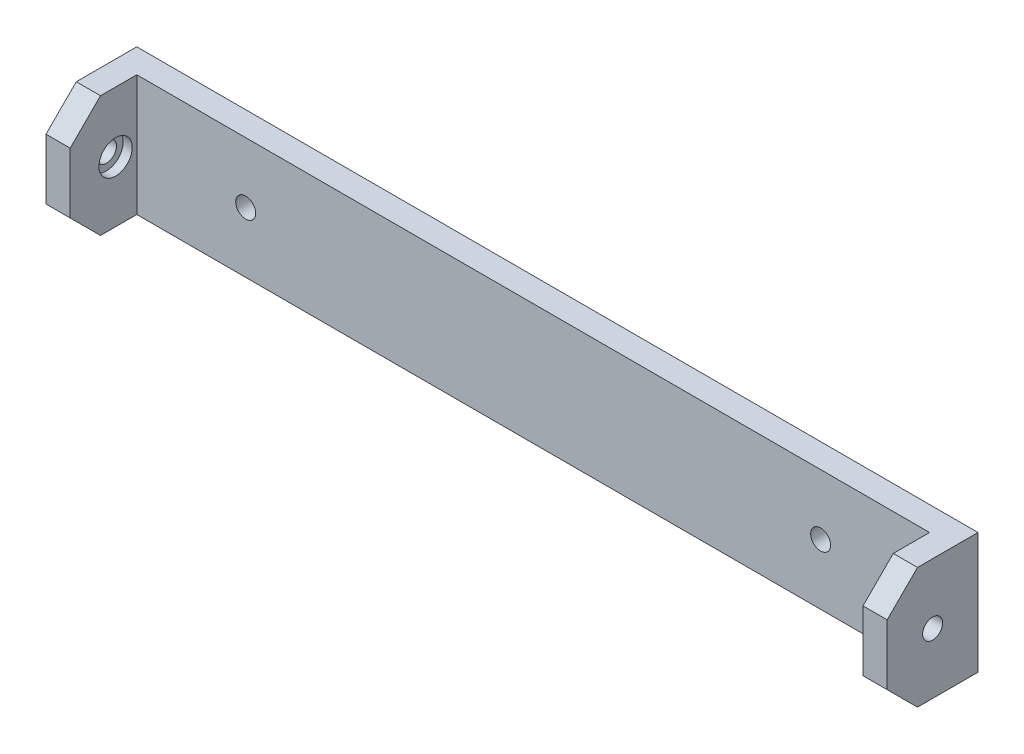
ISO-10303-21;
HEADER;
FILE_DESCRIPTION(('STEP AP214'),'2;1');
FILE_NAME('part.step','',(''),(''),'','','');
FILE_SCHEMA(('AUTOMOTIVE_DESIGN { 1 0 10303 214 1 1 1 1 }'));
ENDSEC;
DATA;
#1=APPLICATION_CONTEXT('core data for automotive mechanical design processes');
#2=APPLICATION_PROTOCOL_DEFINITION('international standard','automotive_design',2000,#1);
#3=PRODUCT_CONTEXT('',#1,'mechanical');
#4=PRODUCT('Part','Part','',(#3));
#5=PRODUCT_RELATED_PRODUCT_CATEGORY('part','',(#4));
#6=PRODUCT_DEFINITION_FORMATION('','',#4);
#7=PRODUCT_DEFINITION_CONTEXT('part definition',#1,'design');
#8=PRODUCT_DEFINITION('design','',#6,#7);
#9=PRODUCT_DEFINITION_SHAPE('','',#8);
#10=(LENGTH_UNIT() NAMED_UNIT(*) SI_UNIT(.MILLI.,.METRE.));
#11=(NAMED_UNIT(*) PLANE_ANGLE_UNIT() SI_UNIT($,.RADIAN.));
#12=(NAMED_UNIT(*) SI_UNIT($,.STERADIAN.) SOLID_ANGLE_UNIT());
#13=UNCERTAINTY_MEASURE_WITH_UNIT(LENGTH_MEASURE(1.E-05),#10,'distance_accuracy_value','');
#14=(GEOMETRIC_REPRESENTATION_CONTEXT(3) GLOBAL_UNCERTAINTY_ASSIGNED_CONTEXT((#13)) GLOBAL_UNIT_ASSIGNED_CONTEXT((#10,
#11,#12)) REPRESENTATION_CONTEXT('',''));
#15=CARTESIAN_POINT('',(0.,0.,0.));
#16=DIRECTION('',(0.,0.,1.));
#17=DIRECTION('',(1.,0.,0.));
#18=AXIS2_PLACEMENT_3D('',#15,#16,#17);
#19=CARTESIAN_POINT('',(65.5,0.,11.));
#20=DIRECTION('',(1.,0.,0.));
#21=DIRECTION('',(0.,1.,0.));
#22=AXIS2_PLACEMENT_3D('',#19,#20,#21);
#23=PLANE('',#22);
#24=DIRECTION('',(0.,-1.,0.));
#25=VECTOR('',#24,1.);
#26=CARTESIAN_POINT('',(65.5,0.,11.));
#27=LINE('',#26,#25);
#28=CARTESIAN_POINT('',(65.5,5.,11.));
#29=VERTEX_POINT('',#28);
#30=CARTESIAN_POINT('',(65.5,-5.,11.));
#31=VERTEX_POINT('',#30);
#32=EDGE_CURVE('E147',#29,#31,#27,.T.);
#33=ORIENTED_EDGE('',*,*,#32,.F.);
#34=DIRECTION('',(0.,0.707106781186548,-0.707106781186548));
#35=VECTOR('',#34,1.);
#36=CARTESIAN_POINT('',(65.5,5.,11.));
#37=LINE('',#36,#35);
#38=CARTESIAN_POINT('',(65.5,10.,6.));
#39=VERTEX_POINT('',#38);
#40=EDGE_CURVE('E49',#29,#39,#37,.T.);
#41=ORIENTED_EDGE('',*,*,#40,.T.);
#42=DIRECTION('',(0.,0.,-1.));
#43=VECTOR('',#42,1.);
#44=CARTESIAN_POINT('',(65.5,10.,11.));
#45=LINE('',#44,#43);
#46=CARTESIAN_POINT('',(65.5,10.,0.));
#47=VERTEX_POINT('',#46);
#48=EDGE_CURVE('E146',#39,#47,#45,.T.);
#49=ORIENTED_EDGE('',*,*,#48,.T.);
#50=DIRECTION('',(0.,-1.,0.));
#51=VECTOR('',#50,1.);
#52=CARTESIAN_POINT('',(65.5,0.,0.));
#53=LINE('',#52,#51);
#54=CARTESIAN_POINT('',(65.5,-10.,0.));
#55=VERTEX_POINT('',#54);
#56=EDGE_CURVE('E155',#47,#55,#53,.T.);
#57=ORIENTED_EDGE('',*,*,#56,.T.);
#58=DIRECTION('',(0.,0.,-1.));
#59=VECTOR('',#58,1.);
#60=CARTESIAN_POINT('',(65.5,-10.,11.));
#61=LINE('',#60,#59);
#62=CARTESIAN_POINT('',(65.5,-10.,6.));
#63=VERTEX_POINT('',#62);
#64=EDGE_CURVE('E136',#63,#55,#61,.T.);
#65=ORIENTED_EDGE('',*,*,#64,.F.);
#66=DIRECTION('',(0.,-0.707106781186548,-0.707106781186548));
#67=VECTOR('',#66,1.);
#68=CARTESIAN_POINT('',(65.5,-10.,6.));
#69=LINE('',#68,#67);
#70=EDGE_CURVE('E37',#63,#31,#69,.F.);
#71=ORIENTED_EDGE('',*,*,#70,.T.);
#72=EDGE_LOOP('',(#33,#41,#49,#57,#65,#71));
#73=FACE_BOUND('',#72,.T.);
#74=CARTESIAN_POINT('',(65.5,1.22485030690938E-10,3.5));
#75=DIRECTION('',(-1.,0.,0.));
#76=DIRECTION('',(0.,-1.,0.));
#77=AXIS2_PLACEMENT_3D('',#74,#75,#76);
#78=CIRCLE('',#77,2.75);
#79=CARTESIAN_POINT('',(65.5,-2.74999999987751,3.5));
#80=VERTEX_POINT('',#79);
#81=EDGE_CURVE('E444',#80,#80,#78,.T.);
#82=ORIENTED_EDGE('',*,*,#81,.F.);
#83=EDGE_LOOP('',(#82));
#84=FACE_BOUND('',#83,.T.);
#85=ADVANCED_FACE('F16',(#73,#84),#23,.F.);
#86=CARTESIAN_POINT('',(-500000.,-3.06158727938173E-11,3.5));
#87=DIRECTION('',(1.,0.,0.));
#88=DIRECTION('',(0.,1.,0.));
#89=AXIS2_PLACEMENT_3D('',#86,#87,#88);
#90=CYLINDRICAL_SURFACE('',#89,1.65);
#91=CARTESIAN_POINT('',(69.500000000005,0.,3.5));
#92=DIRECTION('',(-1.,0.,0.));
#93=DIRECTION('',(0.,-1.,0.));
#94=AXIS2_PLACEMENT_3D('',#91,#92,#93);
#95=CIRCLE('',#94,1.65);
#96=CARTESIAN_POINT('',(69.500000000005,-1.65,3.5));
#97=VERTEX_POINT('',#96);
#98=EDGE_CURVE('E167',#97,#97,#95,.T.);
#99=ORIENTED_EDGE('',*,*,#98,.F.);
#100=EDGE_LOOP('',(#99));
#101=FACE_BOUND('',#100,.T.);
#102=CARTESIAN_POINT('',(66.9999999999859,0.,3.5));
#103=DIRECTION('',(1.,0.,0.));
#104=DIRECTION('',(0.,1.,0.));
#105=AXIS2_PLACEMENT_3D('',#102,#103,#104);
#106=CIRCLE('',#105,1.65);
#107=CARTESIAN_POINT('',(66.9999999999859,1.65,3.5));
#108=VERTEX_POINT('',#107);
#109=EDGE_CURVE('E448',#108,#108,#106,.T.);
#110=ORIENTED_EDGE('',*,*,#109,.F.);
#111=EDGE_LOOP('',(#110));
#112=FACE_BOUND('',#111,.T.);
#113=ADVANCED_FACE('F388',(#101,#112),#90,.F.);
#114=CARTESIAN_POINT('',(0.,0.,0.));
#115=DIRECTION('',(0.,0.,1.));
#116=DIRECTION('',(1.,0.,0.));
#117=AXIS2_PLACEMENT_3D('',#114,#115,#116);
#118=PLANE('',#117);
#119=ORIENTED_EDGE('',*,*,#56,.F.);
#120=DIRECTION('',(1.,0.,0.));
#121=VECTOR('',#120,1.);
#122=CARTESIAN_POINT('',(-66.8605552431216,10.,0.));
#123=LINE('',#122,#121);
#124=CARTESIAN_POINT('',(-65.5,10.,0.));
#125=VERTEX_POINT('',#124);
#126=EDGE_CURVE('E161',#125,#47,#123,.T.);
#127=ORIENTED_EDGE('',*,*,#126,.F.);
#128=DIRECTION('',(0.,-1.,0.));
#129=VECTOR('',#128,1.);
#130=CARTESIAN_POINT('',(-65.5,0.,0.));
#131=LINE('',#130,#129);
#132=CARTESIAN_POINT('',(-65.5,-10.,0.));
#133=VERTEX_POINT('',#132);
#134=EDGE_CURVE('E158',#125,#133,#131,.T.);
#135=ORIENTED_EDGE('',*,*,#134,.T.);
#136=DIRECTION('',(1.,0.,0.));
#137=VECTOR('',#136,1.);
#138=CARTESIAN_POINT('',(-66.8605552431216,-10.,0.));
#139=LINE('',#138,#137);
#140=EDGE_CURVE('E140',#133,#55,#139,.T.);
#141=ORIENTED_EDGE('',*,*,#140,.T.);
#142=EDGE_LOOP('',(#119,#127,#135,#141));
#143=FACE_BOUND('',#142,.T.);
#144=CARTESIAN_POINT('',(-47.5,0.,0.));
#145=DIRECTION('',(0.,0.,1.));
#146=DIRECTION('',(1.,0.,0.));
#147=AXIS2_PLACEMENT_3D('',#144,#145,#146);
#148=CIRCLE('',#147,1.65);
#149=CARTESIAN_POINT('',(-45.85,0.,0.));
#150=VERTEX_POINT('',#149);
#151=EDGE_CURVE('E160',#150,#150,#148,.T.);
#152=ORIENTED_EDGE('',*,*,#151,.F.);
#153=EDGE_LOOP('',(#152));
#154=FACE_BOUND('',#153,.T.);
#155=CARTESIAN_POINT('',(47.5,0.,0.));
#156=DIRECTION('',(0.,0.,1.));
#157=DIRECTION('',(1.,0.,0.));
#158=AXIS2_PLACEMENT_3D('',#155,#156,#157);
#159=CIRCLE('',#158,1.65);
#160=CARTESIAN_POINT('',(49.15,0.,0.));
#161=VERTEX_POINT('',#160);
#162=EDGE_CURVE('E203',#161,#161,#159,.T.);
#163=ORIENTED_EDGE('',*,*,#162,.F.);
#164=EDGE_LOOP('',(#163));
#165=FACE_BOUND('',#164,.T.);
#166=ADVANCED_FACE('F152',(#143,#154,#165),#118,.T.);
#167=CARTESIAN_POINT('',(-66.8605552431216,10.,-4.));
#168=DIRECTION('',(0.,-1.,0.));
#169=DIRECTION('',(0.,0.,-1.));
#170=AXIS2_PLACEMENT_3D('',#167,#168,#169);
#171=PLANE('',#170);
#172=DIRECTION('',(0.,0.,1.));
#173=VECTOR('',#172,1.);
#174=CARTESIAN_POINT('',(-69.5,10.,-4.));
#175=LINE('',#174,#173);
#176=CARTESIAN_POINT('',(-69.5,10.,-4.));
#177=VERTEX_POINT('',#176);
#178=CARTESIAN_POINT('',(-69.5,10.,6.));
#179=VERTEX_POINT('',#178);
#180=EDGE_CURVE('E241',#177,#179,#175,.T.);
#181=ORIENTED_EDGE('',*,*,#180,.T.);
#182=DIRECTION('',(1.,0.,0.));
#183=VECTOR('',#182,1.);
#184=CARTESIAN_POINT('',(-65.5,10.,6.));
#185=LINE('',#184,#183);
#186=CARTESIAN_POINT('',(-65.5,10.,6.));
#187=VERTEX_POINT('',#186);
#188=EDGE_CURVE('E272',#179,#187,#185,.T.);
#189=ORIENTED_EDGE('',*,*,#188,.T.);
#190=DIRECTION('',(0.,0.,-1.));
#191=VECTOR('',#190,1.);
#192=CARTESIAN_POINT('',(-65.5,10.,11.));
#193=LINE('',#192,#191);
#194=EDGE_CURVE('E191',#187,#125,#193,.T.);
#195=ORIENTED_EDGE('',*,*,#194,.T.);
#196=ORIENTED_EDGE('',*,*,#126,.T.);
#197=ORIENTED_EDGE('',*,*,#48,.F.);
#198=DIRECTION('',(1.,0.,0.));
#199=VECTOR('',#198,1.);
#200=CARTESIAN_POINT('',(69.5,10.,6.));
#201=LINE('',#200,#199);
#202=CARTESIAN_POINT('',(69.5,10.,6.));
#203=VERTEX_POINT('',#202);
#204=EDGE_CURVE('E269',#39,#203,#201,.T.);
#205=ORIENTED_EDGE('',*,*,#204,.T.);
#206=DIRECTION('',(0.,0.,1.));
#207=VECTOR('',#206,1.);
#208=CARTESIAN_POINT('',(69.5,10.,-4.));
#209=LINE('',#208,#207);
#210=CARTESIAN_POINT('',(69.5,10.,-4.));
#211=VERTEX_POINT('',#210);
#212=EDGE_CURVE('E223',#211,#203,#209,.T.);
#213=ORIENTED_EDGE('',*,*,#212,.F.);
#214=DIRECTION('',(1.,0.,0.));
#215=VECTOR('',#214,1.);
#216=CARTESIAN_POINT('',(-66.8605552431216,10.,-4.));
#217=LINE('',#216,#215);
#218=EDGE_CURVE('E198',#177,#211,#217,.T.);
#219=ORIENTED_EDGE('',*,*,#218,.F.);
#220=EDGE_LOOP('',(#181,#189,#195,#196,#197,#205,#213,#219));
#221=FACE_BOUND('',#220,.T.);
#222=ADVANCED_FACE('F349',(#221),#171,.F.);
#223=CARTESIAN_POINT('',(-69.5,0.,-4.));
#224=DIRECTION('',(-1.,0.,0.));
#225=DIRECTION('',(0.,-1.,0.));
#226=AXIS2_PLACEMENT_3D('',#223,#224,#225);
#227=PLANE('',#226);
#228=CARTESIAN_POINT('',(-69.500000000005,0.,3.5));
#229=DIRECTION('',(-1.,0.,0.));
#230=DIRECTION('',(0.,-1.,0.));
#231=AXIS2_PLACEMENT_3D('',#228,#229,#230);
#232=CIRCLE('',#231,1.65);
#233=CARTESIAN_POINT('',(-69.500000000005,-1.65,3.5));
#234=VERTEX_POINT('',#233);
#235=EDGE_CURVE('E177',#234,#234,#232,.F.);
#236=ORIENTED_EDGE('',*,*,#235,.T.);
#237=EDGE_LOOP('',(#236));
#238=FACE_BOUND('',#237,.T.);
#239=DIRECTION('',(0.,0.,1.));
#240=VECTOR('',#239,1.);
#241=CARTESIAN_POINT('',(-69.5,-10.,-4.));
#242=LINE('',#241,#240);
#243=CARTESIAN_POINT('',(-69.5,-10.,-4.));
#244=VERTEX_POINT('',#243);
#245=CARTESIAN_POINT('',(-69.5,-10.,6.));
#246=VERTEX_POINT('',#245);
#247=EDGE_CURVE('E234',#244,#246,#242,.T.);
#248=ORIENTED_EDGE('',*,*,#247,.T.);
#249=DIRECTION('',(0.,-0.707106781186548,-0.707106781186548));
#250=VECTOR('',#249,1.);
#251=CARTESIAN_POINT('',(-69.5,-10.,6.));
#252=LINE('',#251,#250);
#253=CARTESIAN_POINT('',(-69.5,-5.,11.));
#254=VERTEX_POINT('',#253);
#255=EDGE_CURVE('E266',#246,#254,#252,.F.);
#256=ORIENTED_EDGE('',*,*,#255,.T.);
#257=DIRECTION('',(0.,-1.,0.));
#258=VECTOR('',#257,1.);
#259=CARTESIAN_POINT('',(-69.5,0.,11.));
#260=LINE('',#259,#258);
#261=CARTESIAN_POINT('',(-69.5,5.,11.));
#262=VERTEX_POINT('',#261);
#263=EDGE_CURVE('E187',#262,#254,#260,.T.);
#264=ORIENTED_EDGE('',*,*,#263,.F.);
#265=DIRECTION('',(0.,0.707106781186548,-0.707106781186548));
#266=VECTOR('',#265,1.);
#267=CARTESIAN_POINT('',(-69.5,10.,6.));
#268=LINE('',#267,#266);
#269=EDGE_CURVE('E263',#262,#179,#268,.T.);
#270=ORIENTED_EDGE('',*,*,#269,.T.);
#271=ORIENTED_EDGE('',*,*,#180,.F.);
#272=DIRECTION('',(0.,-1.,0.));
#273=VECTOR('',#272,1.);
#274=CARTESIAN_POINT('',(-69.5,0.,-4.));
#275=LINE('',#274,#273);
#276=EDGE_CURVE('E202',#177,#244,#275,.T.);
#277=ORIENTED_EDGE('',*,*,#276,.T.);
#278=EDGE_LOOP('',(#248,#256,#264,#270,#271,#277));
#279=FACE_BOUND('',#278,.T.);
#280=ADVANCED_FACE('F353',(#238,#279),#227,.T.);
#281=CARTESIAN_POINT('',(-66.8605552431216,-10.,-4.));
#282=DIRECTION('',(0.,-1.,0.));
#283=DIRECTION('',(0.,0.,-1.));
#284=AXIS2_PLACEMENT_3D('',#281,#282,#283);
#285=PLANE('',#284);
#286=DIRECTION('',(0.,0.,-1.));
#287=VECTOR('',#286,1.);
#288=CARTESIAN_POINT('',(-65.5,-10.,11.));
#289=LINE('',#288,#287);
#290=CARTESIAN_POINT('',(-65.5,-10.,6.));
#291=VERTEX_POINT('',#290);
#292=EDGE_CURVE('E193',#291,#133,#289,.T.);
#293=ORIENTED_EDGE('',*,*,#292,.F.);
#294=DIRECTION('',(-1.,0.,0.));
#295=VECTOR('',#294,1.);
#296=CARTESIAN_POINT('',(-66.8605552431216,-10.,6.));
#297=LINE('',#296,#295);
#298=EDGE_CURVE('E260',#291,#246,#297,.T.);
#299=ORIENTED_EDGE('',*,*,#298,.T.);
#300=ORIENTED_EDGE('',*,*,#247,.F.);
#301=DIRECTION('',(1.,0.,0.));
#302=VECTOR('',#301,1.);
#303=CARTESIAN_POINT('',(-66.8605552431216,-10.,-4.));
#304=LINE('',#303,#302);
#305=CARTESIAN_POINT('',(69.5,-10.,-4.));
#306=VERTEX_POINT('',#305);
#307=EDGE_CURVE('E207',#244,#306,#304,.T.);
#308=ORIENTED_EDGE('',*,*,#307,.T.);
#309=DIRECTION('',(0.,0.,1.));
#310=VECTOR('',#309,1.);
#311=CARTESIAN_POINT('',(69.5,-10.,-4.));
#312=LINE('',#311,#310);
#313=CARTESIAN_POINT('',(69.5,-10.,6.));
#314=VERTEX_POINT('',#313);
#315=EDGE_CURVE('E231',#306,#314,#312,.T.);
#316=ORIENTED_EDGE('',*,*,#315,.T.);
#317=DIRECTION('',(-1.,0.,0.));
#318=VECTOR('',#317,1.);
#319=CARTESIAN_POINT('',(-66.8605552431216,-10.,6.));
#320=LINE('',#319,#318);
#321=EDGE_CURVE('E143',#314,#63,#320,.T.);
#322=ORIENTED_EDGE('',*,*,#321,.T.);
#323=ORIENTED_EDGE('',*,*,#64,.T.);
#324=ORIENTED_EDGE('',*,*,#140,.F.);
#325=EDGE_LOOP('',(#293,#299,#300,#308,#316,#322,#323,#324));
#326=FACE_BOUND('',#325,.T.);
#327=ADVANCED_FACE('F139',(#326),#285,.T.);
#328=CARTESIAN_POINT('',(-47.5,0.,-4.));
#329=DIRECTION('',(0.,0.,1.));
#330=DIRECTION('',(1.,0.,0.));
#331=AXIS2_PLACEMENT_3D('',#328,#329,#330);
#332=CYLINDRICAL_SURFACE('',#331,1.65);
#333=CARTESIAN_POINT('',(-47.5,0.,-4.));
#334=DIRECTION('',(0.,0.,1.));
#335=DIRECTION('',(1.,0.,0.));
#336=AXIS2_PLACEMENT_3D('',#333,#334,#335);
#337=CIRCLE('',#336,1.65);
#338=CARTESIAN_POINT('',(-45.85,0.,-4.));
#339=VERTEX_POINT('',#338);
#340=EDGE_CURVE('E211',#339,#339,#337,.T.);
#341=ORIENTED_EDGE('',*,*,#340,.F.);
#342=EDGE_LOOP('',(#341));
#343=FACE_BOUND('',#342,.T.);
#344=ORIENTED_EDGE('',*,*,#151,.T.);
#345=EDGE_LOOP('',(#344));
#346=FACE_BOUND('',#345,.T.);
#347=ADVANCED_FACE('F362',(#343,#346),#332,.F.);
#348=CARTESIAN_POINT('',(69.5,0.,-4.));
#349=DIRECTION('',(-1.,0.,0.));
#350=DIRECTION('',(0.,-1.,0.));
#351=AXIS2_PLACEMENT_3D('',#348,#349,#350);
#352=PLANE('',#351);
#353=ORIENTED_EDGE('',*,*,#98,.T.);
#354=EDGE_LOOP('',(#353));
#355=FACE_BOUND('',#354,.T.);
#356=ORIENTED_EDGE('',*,*,#212,.T.);
#357=DIRECTION('',(0.,-0.707106781186548,0.707106781186548));
#358=VECTOR('',#357,1.);
#359=CARTESIAN_POINT('',(69.5,5.,11.));
#360=LINE('',#359,#358);
#361=CARTESIAN_POINT('',(69.5,5.,11.));
#362=VERTEX_POINT('',#361);
#363=EDGE_CURVE('E10',#203,#362,#360,.T.);
#364=ORIENTED_EDGE('',*,*,#363,.T.);
#365=DIRECTION('',(0.,-1.,0.));
#366=VECTOR('',#365,1.);
#367=CARTESIAN_POINT('',(69.5,0.,11.));
#368=LINE('',#367,#366);
#369=CARTESIAN_POINT('',(69.5,-5.,11.));
#370=VERTEX_POINT('',#369);
#371=EDGE_CURVE('E166',#362,#370,#368,.T.);
#372=ORIENTED_EDGE('',*,*,#371,.T.);
#373=DIRECTION('',(0.,0.707106781186548,0.707106781186548));
#374=VECTOR('',#373,1.);
#375=CARTESIAN_POINT('',(69.5,-10.,6.));
#376=LINE('',#375,#374);
#377=EDGE_CURVE('E25',#370,#314,#376,.F.);
#378=ORIENTED_EDGE('',*,*,#377,.T.);
#379=ORIENTED_EDGE('',*,*,#315,.F.);
#380=DIRECTION('',(0.,-1.,0.));
#381=VECTOR('',#380,1.);
#382=CARTESIAN_POINT('',(69.5,0.,-4.));
#383=LINE('',#382,#381);
#384=EDGE_CURVE('E219',#211,#306,#383,.T.);
#385=ORIENTED_EDGE('',*,*,#384,.F.);
#386=EDGE_LOOP('',(#356,#364,#372,#378,#379,#385));
#387=FACE_BOUND('',#386,.T.);
#388=ADVANCED_FACE('F289',(#355,#387),#352,.F.);
#389=CARTESIAN_POINT('',(47.5,0.,-4.));
#390=DIRECTION('',(0.,0.,1.));
#391=DIRECTION('',(1.,0.,0.));
#392=AXIS2_PLACEMENT_3D('',#389,#390,#391);
#393=CYLINDRICAL_SURFACE('',#392,1.65);
#394=CARTESIAN_POINT('',(47.5,0.,-4.));
#395=DIRECTION('',(0.,0.,1.));
#396=DIRECTION('',(1.,0.,0.));
#397=AXIS2_PLACEMENT_3D('',#394,#395,#396);
#398=CIRCLE('',#397,1.65);
#399=CARTESIAN_POINT('',(49.15,0.,-4.));
#400=VERTEX_POINT('',#399);
#401=EDGE_CURVE('E215',#400,#400,#398,.T.);
#402=ORIENTED_EDGE('',*,*,#401,.F.);
#403=EDGE_LOOP('',(#402));
#404=FACE_BOUND('',#403,.T.);
#405=ORIENTED_EDGE('',*,*,#162,.T.);
#406=EDGE_LOOP('',(#405));
#407=FACE_BOUND('',#406,.T.);
#408=ADVANCED_FACE('F374',(#404,#407),#393,.F.);
#409=CARTESIAN_POINT('',(0.,0.,-4.));
#410=DIRECTION('',(0.,0.,1.));
#411=DIRECTION('',(1.,0.,0.));
#412=AXIS2_PLACEMENT_3D('',#409,#410,#411);
#413=PLANE('',#412);
#414=ORIENTED_EDGE('',*,*,#218,.T.);
#415=ORIENTED_EDGE('',*,*,#384,.T.);
#416=ORIENTED_EDGE('',*,*,#307,.F.);
#417=ORIENTED_EDGE('',*,*,#276,.F.);
#418=EDGE_LOOP('',(#414,#415,#416,#417));
#419=FACE_BOUND('',#418,.T.);
#420=ORIENTED_EDGE('',*,*,#340,.T.);
#421=EDGE_LOOP('',(#420));
#422=FACE_BOUND('',#421,.T.);
#423=ORIENTED_EDGE('',*,*,#401,.T.);
#424=EDGE_LOOP('',(#423));
#425=FACE_BOUND('',#424,.T.);
#426=ADVANCED_FACE('F381',(#419,#422,#425),#413,.F.);
#427=CARTESIAN_POINT('',(-65.5,0.,11.));
#428=DIRECTION('',(1.,0.,0.));
#429=DIRECTION('',(0.,1.,0.));
#430=AXIS2_PLACEMENT_3D('',#427,#428,#429);
#431=PLANE('',#430);
#432=CARTESIAN_POINT('',(-65.5,0.,3.5));
#433=DIRECTION('',(1.,0.,0.));
#434=DIRECTION('',(0.,1.,0.));
#435=AXIS2_PLACEMENT_3D('',#432,#433,#434);
#436=CIRCLE('',#435,2.75);
#437=CARTESIAN_POINT('',(-65.5,2.75,3.5));
#438=VERTEX_POINT('',#437);
#439=EDGE_CURVE('E413',#438,#438,#436,.T.);
#440=ORIENTED_EDGE('',*,*,#439,.F.);
#441=EDGE_LOOP('',(#440));
#442=FACE_BOUND('',#441,.T.);
#443=DIRECTION('',(0.,-1.,0.));
#444=VECTOR('',#443,1.);
#445=CARTESIAN_POINT('',(-65.5,0.,11.));
#446=LINE('',#445,#444);
#447=CARTESIAN_POINT('',(-65.5,5.,11.));
#448=VERTEX_POINT('',#447);
#449=CARTESIAN_POINT('',(-65.5,-5.,11.));
#450=VERTEX_POINT('',#449);
#451=EDGE_CURVE('E183',#448,#450,#446,.T.);
#452=ORIENTED_EDGE('',*,*,#451,.T.);
#453=DIRECTION('',(0.,0.707106781186548,0.707106781186548));
#454=VECTOR('',#453,1.);
#455=CARTESIAN_POINT('',(-65.5,-2.5,13.5));
#456=LINE('',#455,#454);
#457=EDGE_CURVE('E255',#450,#291,#456,.F.);
#458=ORIENTED_EDGE('',*,*,#457,.T.);
#459=ORIENTED_EDGE('',*,*,#292,.T.);
#460=ORIENTED_EDGE('',*,*,#134,.F.);
#461=ORIENTED_EDGE('',*,*,#194,.F.);
#462=DIRECTION('',(0.,-0.707106781186548,0.707106781186548));
#463=VECTOR('',#462,1.);
#464=CARTESIAN_POINT('',(-65.5,2.5,13.5));
#465=LINE('',#464,#463);
#466=EDGE_CURVE('E252',#187,#448,#465,.T.);
#467=ORIENTED_EDGE('',*,*,#466,.T.);
#468=EDGE_LOOP('',(#452,#458,#459,#460,#461,#467));
#469=FACE_BOUND('',#468,.T.);
#470=ADVANCED_FACE('F337',(#442,#469),#431,.T.);
#471=CARTESIAN_POINT('',(0.,0.,11.));
#472=DIRECTION('',(0.,0.,1.));
#473=DIRECTION('',(1.,0.,0.));
#474=AXIS2_PLACEMENT_3D('',#471,#472,#473);
#475=PLANE('',#474);
#476=ORIENTED_EDGE('',*,*,#263,.T.);
#477=DIRECTION('',(1.,0.,0.));
#478=VECTOR('',#477,1.);
#479=CARTESIAN_POINT('',(0.,-5.,11.));
#480=LINE('',#479,#478);
#481=EDGE_CURVE('E248',#254,#450,#480,.T.);
#482=ORIENTED_EDGE('',*,*,#481,.T.);
#483=ORIENTED_EDGE('',*,*,#451,.F.);
#484=DIRECTION('',(-1.,0.,0.));
#485=VECTOR('',#484,1.);
#486=CARTESIAN_POINT('',(-69.5,5.,11.));
#487=LINE('',#486,#485);
#488=EDGE_CURVE('E245',#448,#262,#487,.T.);
#489=ORIENTED_EDGE('',*,*,#488,.T.);
#490=EDGE_LOOP('',(#476,#482,#483,#489));
#491=FACE_BOUND('',#490,.T.);
#492=ADVANCED_FACE('F333',(#491),#475,.T.);
#493=CARTESIAN_POINT('',(0.,0.,11.));
#494=DIRECTION('',(0.,0.,1.));
#495=DIRECTION('',(1.,0.,0.));
#496=AXIS2_PLACEMENT_3D('',#493,#494,#495);
#497=PLANE('',#496);
#498=ORIENTED_EDGE('',*,*,#371,.F.);
#499=DIRECTION('',(-1.,0.,0.));
#500=VECTOR('',#499,1.);
#501=CARTESIAN_POINT('',(65.5,5.,11.));
#502=LINE('',#501,#500);
#503=EDGE_CURVE('E279',#362,#29,#502,.T.);
#504=ORIENTED_EDGE('',*,*,#503,.T.);
#505=ORIENTED_EDGE('',*,*,#32,.T.);
#506=DIRECTION('',(1.,0.,0.));
#507=VECTOR('',#506,1.);
#508=CARTESIAN_POINT('',(0.,-5.,11.));
#509=LINE('',#508,#507);
#510=EDGE_CURVE('E276',#31,#370,#509,.T.);
#511=ORIENTED_EDGE('',*,*,#510,.T.);
#512=EDGE_LOOP('',(#498,#504,#505,#511));
#513=FACE_BOUND('',#512,.T.);
#514=ADVANCED_FACE('F296',(#513),#497,.T.);
#515=CARTESIAN_POINT('',(-67.,0.,3.5));
#516=DIRECTION('',(1.,0.,0.));
#517=DIRECTION('',(0.,1.,0.));
#518=AXIS2_PLACEMENT_3D('',#515,#516,#517);
#519=CIRCLE('',#518,1.65);
#520=CARTESIAN_POINT('',(-67.,1.65,3.5));
#521=VERTEX_POINT('',#520);
#522=EDGE_CURVE('E409',#521,#521,#519,.T.);
#523=ORIENTED_EDGE('',*,*,#522,.T.);
#524=EDGE_LOOP('',(#523));
#525=FACE_BOUND('',#524,.T.);
#526=ORIENTED_EDGE('',*,*,#235,.F.);
#527=EDGE_LOOP('',(#526));
#528=FACE_BOUND('',#527,.T.);
#529=ADVANCED_FACE('F345',(#525,#528),#90,.F.);
#530=CARTESIAN_POINT('',(-67.,0.,3.5));
#531=DIRECTION('',(1.,0.,0.));
#532=DIRECTION('',(0.,1.,0.));
#533=AXIS2_PLACEMENT_3D('',#530,#531,#532);
#534=CYLINDRICAL_SURFACE('',#533,2.75);
#535=CARTESIAN_POINT('',(-67.,0.,3.5));
#536=DIRECTION('',(1.,0.,0.));
#537=DIRECTION('',(0.,1.,0.));
#538=AXIS2_PLACEMENT_3D('',#535,#536,#537);
#539=CIRCLE('',#538,2.75);
#540=CARTESIAN_POINT('',(-67.,2.75,3.5));
#541=VERTEX_POINT('',#540);
#542=EDGE_CURVE('E405',#541,#541,#539,.T.);
#543=ORIENTED_EDGE('',*,*,#542,.F.);
#544=EDGE_LOOP('',(#543));
#545=FACE_BOUND('',#544,.T.);
#546=ORIENTED_EDGE('',*,*,#439,.T.);
#547=EDGE_LOOP('',(#546));
#548=FACE_BOUND('',#547,.T.);
#549=ADVANCED_FACE('F429',(#545,#548),#534,.F.);
#550=CARTESIAN_POINT('',(-67.,0.,5.5));
#551=DIRECTION('',(1.,0.,0.));
#552=DIRECTION('',(0.,1.,0.));
#553=AXIS2_PLACEMENT_3D('',#550,#551,#552);
#554=PLANE('',#553);
#555=ORIENTED_EDGE('',*,*,#522,.F.);
#556=EDGE_LOOP('',(#555));
#557=FACE_BOUND('',#556,.T.);
#558=ORIENTED_EDGE('',*,*,#542,.T.);
#559=EDGE_LOOP('',(#558));
#560=FACE_BOUND('',#559,.T.);
#561=ADVANCED_FACE('F424',(#557,#560),#554,.T.);
#562=CARTESIAN_POINT('',(67.,1.22485489933488E-10,3.5));
#563=DIRECTION('',(-1.,0.,0.));
#564=DIRECTION('',(0.,-1.,0.));
#565=AXIS2_PLACEMENT_3D('',#562,#563,#564);
#566=CYLINDRICAL_SURFACE('',#565,2.75);
#567=CARTESIAN_POINT('',(67.,1.22485489933488E-10,3.5));
#568=DIRECTION('',(-1.,0.,0.));
#569=DIRECTION('',(0.,-1.,0.));
#570=AXIS2_PLACEMENT_3D('',#567,#568,#569);
#571=CIRCLE('',#570,2.75);
#572=CARTESIAN_POINT('',(67.,-2.74999999987751,3.5));
#573=VERTEX_POINT('',#572);
#574=EDGE_CURVE('E418',#573,#573,#571,.T.);
#575=ORIENTED_EDGE('',*,*,#574,.F.);
#576=EDGE_LOOP('',(#575));
#577=FACE_BOUND('',#576,.T.);
#578=ORIENTED_EDGE('',*,*,#81,.T.);
#579=EDGE_LOOP('',(#578));
#580=FACE_BOUND('',#579,.T.);
#581=ADVANCED_FACE('F428',(#577,#580),#566,.F.);
#582=CARTESIAN_POINT('',(67.,0.,5.5));
#583=DIRECTION('',(-1.,0.,0.));
#584=DIRECTION('',(0.,-1.,0.));
#585=AXIS2_PLACEMENT_3D('',#582,#583,#584);
#586=PLANE('',#585);
#587=ORIENTED_EDGE('',*,*,#109,.T.);
#588=EDGE_LOOP('',(#587));
#589=FACE_BOUND('',#588,.T.);
#590=ORIENTED_EDGE('',*,*,#574,.T.);
#591=EDGE_LOOP('',(#590));
#592=FACE_BOUND('',#591,.T.);
#593=ADVANCED_FACE('F321',(#589,#592),#586,.T.);
#594=CARTESIAN_POINT('',(0.,-5.,11.));
#595=DIRECTION('',(0.,0.707106781186548,-0.707106781186548));
#596=DIRECTION('',(1.,0.,0.));
#597=AXIS2_PLACEMENT_3D('',#594,#595,#596);
#598=PLANE('',#597);
#599=ORIENTED_EDGE('',*,*,#255,.F.);
#600=ORIENTED_EDGE('',*,*,#298,.F.);
#601=ORIENTED_EDGE('',*,*,#457,.F.);
#602=ORIENTED_EDGE('',*,*,#481,.F.);
#603=EDGE_LOOP('',(#599,#600,#601,#602));
#604=FACE_BOUND('',#603,.T.);
#605=ADVANCED_FACE('F312',(#604),#598,.F.);
#606=CARTESIAN_POINT('',(-66.8605552431216,10.,6.));
#607=DIRECTION('',(0.,0.707106781186548,0.707106781186548));
#608=DIRECTION('',(-1.,0.,0.));
#609=AXIS2_PLACEMENT_3D('',#606,#607,#608);
#610=PLANE('',#609);
#611=ORIENTED_EDGE('',*,*,#269,.F.);
#612=ORIENTED_EDGE('',*,*,#488,.F.);
#613=ORIENTED_EDGE('',*,*,#466,.F.);
#614=ORIENTED_EDGE('',*,*,#188,.F.);
#615=EDGE_LOOP('',(#611,#612,#613,#614));
#616=FACE_BOUND('',#615,.T.);
#617=ADVANCED_FACE('F307',(#616),#610,.T.);
#618=CARTESIAN_POINT('',(0.,5.,11.));
#619=DIRECTION('',(0.,0.707106781186548,0.707106781186548));
#620=DIRECTION('',(1.,0.,0.));
#621=AXIS2_PLACEMENT_3D('',#618,#619,#620);
#622=PLANE('',#621);
#623=ORIENTED_EDGE('',*,*,#363,.F.);
#624=ORIENTED_EDGE('',*,*,#204,.F.);
#625=ORIENTED_EDGE('',*,*,#40,.F.);
#626=ORIENTED_EDGE('',*,*,#503,.F.);
#627=EDGE_LOOP('',(#623,#624,#625,#626));
#628=FACE_BOUND('',#627,.T.);
#629=ADVANCED_FACE('F311',(#628),#622,.T.);
#630=CARTESIAN_POINT('',(-66.8605552431216,-10.,6.));
#631=DIRECTION('',(0.,0.707106781186548,-0.707106781186548));
#632=DIRECTION('',(-1.,0.,0.));
#633=AXIS2_PLACEMENT_3D('',#630,#631,#632);
#634=PLANE('',#633);
#635=ORIENTED_EDGE('',*,*,#377,.F.);
#636=ORIENTED_EDGE('',*,*,#510,.F.);
#637=ORIENTED_EDGE('',*,*,#70,.F.);
#638=ORIENTED_EDGE('',*,*,#321,.F.);
#639=EDGE_LOOP('',(#635,#636,#637,#638));
#640=FACE_BOUND('',#639,.T.);
#641=ADVANCED_FACE('F18',(#640),#634,.F.);
#642=CLOSED_SHELL('',(#85,#113,#166,#222,#280,#327,#347,#388,#408,#426,#470,#492,#514,#529,#549,
#561,#581,#593,#605,#617,#629,#641));
#643=MANIFOLD_SOLID_BREP('B1',#642);
#644=ADVANCED_BREP_SHAPE_REPRESENTATION('',(#18,#643),#14);
#645=SHAPE_DEFINITION_REPRESENTATION(#9,#644);
ENDSEC;
END-ISO-10303-21;
